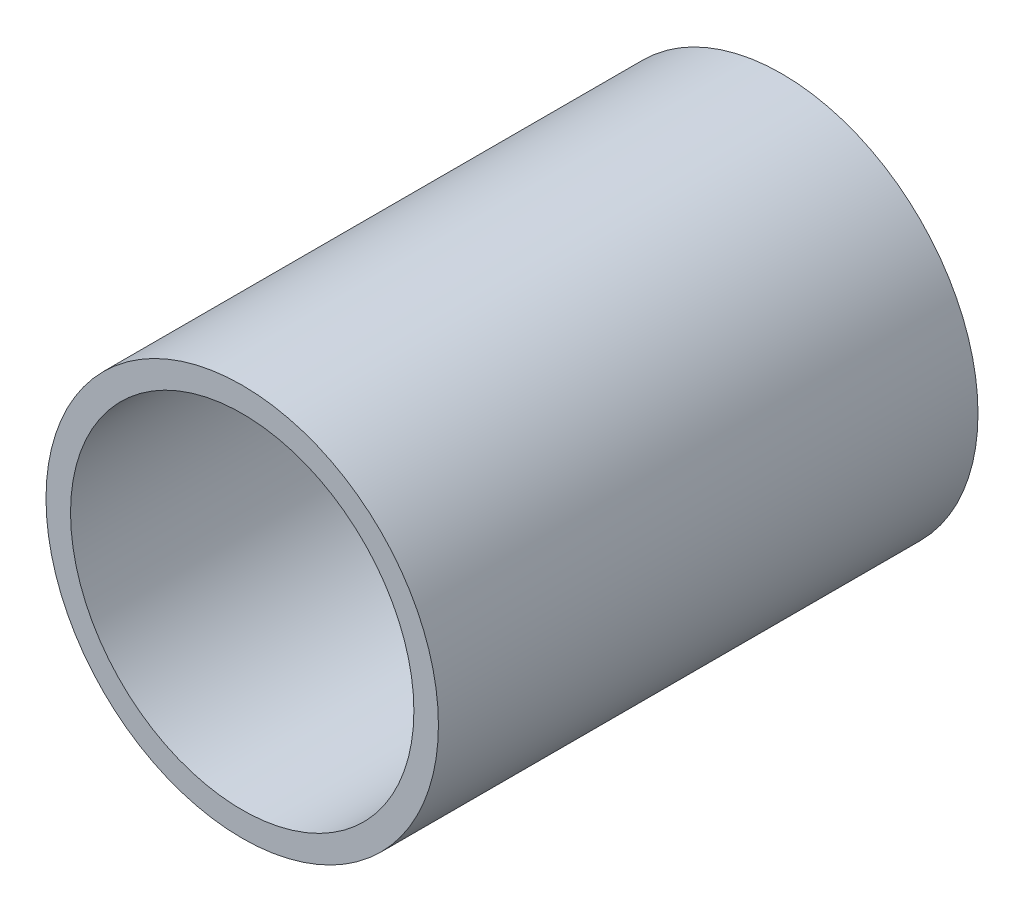
ISO-10303-21;
HEADER;
FILE_DESCRIPTION(('STEP AP214'),'2;1');
FILE_NAME('part.step','',(''),(''),'','','');
FILE_SCHEMA(('AUTOMOTIVE_DESIGN { 1 0 10303 214 1 1 1 1 }'));
ENDSEC;
DATA;
#1=APPLICATION_CONTEXT('core data for automotive mechanical design processes');
#2=APPLICATION_PROTOCOL_DEFINITION('international standard','automotive_design',2000,#1);
#3=PRODUCT_CONTEXT('',#1,'mechanical');
#4=PRODUCT('Part','Part','',(#3));
#5=PRODUCT_RELATED_PRODUCT_CATEGORY('part','',(#4));
#6=PRODUCT_DEFINITION_FORMATION('','',#4);
#7=PRODUCT_DEFINITION_CONTEXT('part definition',#1,'design');
#8=PRODUCT_DEFINITION('design','',#6,#7);
#9=PRODUCT_DEFINITION_SHAPE('','',#8);
#10=(LENGTH_UNIT() NAMED_UNIT(*) SI_UNIT(.MILLI.,.METRE.));
#11=(NAMED_UNIT(*) PLANE_ANGLE_UNIT() SI_UNIT($,.RADIAN.));
#12=(NAMED_UNIT(*) SI_UNIT($,.STERADIAN.) SOLID_ANGLE_UNIT());
#13=UNCERTAINTY_MEASURE_WITH_UNIT(LENGTH_MEASURE(1.E-05),#10,'distance_accuracy_value','');
#14=(GEOMETRIC_REPRESENTATION_CONTEXT(3) GLOBAL_UNCERTAINTY_ASSIGNED_CONTEXT((#13)) GLOBAL_UNIT_ASSIGNED_CONTEXT((#10,
#11,#12)) REPRESENTATION_CONTEXT('',''));
#15=CARTESIAN_POINT('',(0.,0.,0.));
#16=DIRECTION('',(0.,0.,1.));
#17=DIRECTION('',(1.,0.,0.));
#18=AXIS2_PLACEMENT_3D('',#15,#16,#17);
#19=CARTESIAN_POINT('',(0.,0.,110.));
#20=DIRECTION('',(0.,0.,1.));
#21=DIRECTION('',(1.,0.,0.));
#22=AXIS2_PLACEMENT_3D('',#19,#20,#21);
#23=PLANE('',#22);
#24=CARTESIAN_POINT('',(0.,0.,110.));
#25=DIRECTION('',(0.,0.,1.));
#26=DIRECTION('',(1.,0.,0.));
#27=AXIS2_PLACEMENT_3D('',#24,#25,#26);
#28=CIRCLE('',#27,40.);
#29=CARTESIAN_POINT('',(40.,0.,110.));
#30=VERTEX_POINT('',#29);
#31=EDGE_CURVE('E10',#30,#30,#28,.T.);
#32=ORIENTED_EDGE('',*,*,#31,.T.);
#33=EDGE_LOOP('',(#32));
#34=FACE_BOUND('',#33,.T.);
#35=CARTESIAN_POINT('',(0.,0.,110.));
#36=DIRECTION('',(0.,0.,1.));
#37=DIRECTION('',(1.,0.,0.));
#38=AXIS2_PLACEMENT_3D('',#35,#36,#37);
#39=CIRCLE('',#38,35.);
#40=CARTESIAN_POINT('',(35.,0.,110.));
#41=VERTEX_POINT('',#40);
#42=EDGE_CURVE('E42',#41,#41,#39,.T.);
#43=ORIENTED_EDGE('',*,*,#42,.F.);
#44=EDGE_LOOP('',(#43));
#45=FACE_BOUND('',#44,.T.);
#46=ADVANCED_FACE('F31',(#34,#45),#23,.T.);
#47=CARTESIAN_POINT('',(0.,0.,0.));
#48=DIRECTION('',(0.,0.,1.));
#49=DIRECTION('',(1.,0.,0.));
#50=AXIS2_PLACEMENT_3D('',#47,#48,#49);
#51=PLANE('',#50);
#52=CARTESIAN_POINT('',(0.,0.,0.));
#53=DIRECTION('',(0.,0.,1.));
#54=DIRECTION('',(1.,0.,0.));
#55=AXIS2_PLACEMENT_3D('',#52,#53,#54);
#56=CIRCLE('',#55,40.);
#57=CARTESIAN_POINT('',(40.,0.,0.));
#58=VERTEX_POINT('',#57);
#59=EDGE_CURVE('E35',#58,#58,#56,.T.);
#60=ORIENTED_EDGE('',*,*,#59,.F.);
#61=EDGE_LOOP('',(#60));
#62=FACE_BOUND('',#61,.T.);
#63=CARTESIAN_POINT('',(0.,0.,0.));
#64=DIRECTION('',(0.,0.,1.));
#65=DIRECTION('',(1.,0.,0.));
#66=AXIS2_PLACEMENT_3D('',#63,#64,#65);
#67=CIRCLE('',#66,35.);
#68=CARTESIAN_POINT('',(35.,0.,0.));
#69=VERTEX_POINT('',#68);
#70=EDGE_CURVE('E44',#69,#69,#67,.T.);
#71=ORIENTED_EDGE('',*,*,#70,.T.);
#72=EDGE_LOOP('',(#71));
#73=FACE_BOUND('',#72,.T.);
#74=ADVANCED_FACE('F54',(#62,#73),#51,.F.);
#75=CARTESIAN_POINT('',(0.,0.,110.));
#76=DIRECTION('',(0.,0.,-1.));
#77=DIRECTION('',(-1.,0.,0.));
#78=AXIS2_PLACEMENT_3D('',#75,#76,#77);
#79=CYLINDRICAL_SURFACE('',#78,40.);
#80=ORIENTED_EDGE('',*,*,#31,.F.);
#81=EDGE_LOOP('',(#80));
#82=FACE_BOUND('',#81,.T.);
#83=ORIENTED_EDGE('',*,*,#59,.T.);
#84=EDGE_LOOP('',(#83));
#85=FACE_BOUND('',#84,.T.);
#86=ADVANCED_FACE('F33',(#82,#85),#79,.T.);
#87=CARTESIAN_POINT('',(0.,0.,110.));
#88=DIRECTION('',(0.,0.,-1.));
#89=DIRECTION('',(-1.,0.,0.));
#90=AXIS2_PLACEMENT_3D('',#87,#88,#89);
#91=CYLINDRICAL_SURFACE('',#90,35.);
#92=ORIENTED_EDGE('',*,*,#42,.T.);
#93=EDGE_LOOP('',(#92));
#94=FACE_BOUND('',#93,.T.);
#95=ORIENTED_EDGE('',*,*,#70,.F.);
#96=EDGE_LOOP('',(#95));
#97=FACE_BOUND('',#96,.T.);
#98=ADVANCED_FACE('F50',(#94,#97),#91,.F.);
#99=CLOSED_SHELL('',(#46,#74,#86,#98));
#100=MANIFOLD_SOLID_BREP('B2',#99);
#101=ADVANCED_BREP_SHAPE_REPRESENTATION('',(#18,#100),#14);
#102=SHAPE_DEFINITION_REPRESENTATION(#9,#101);
ENDSEC;
END-ISO-10303-21;
